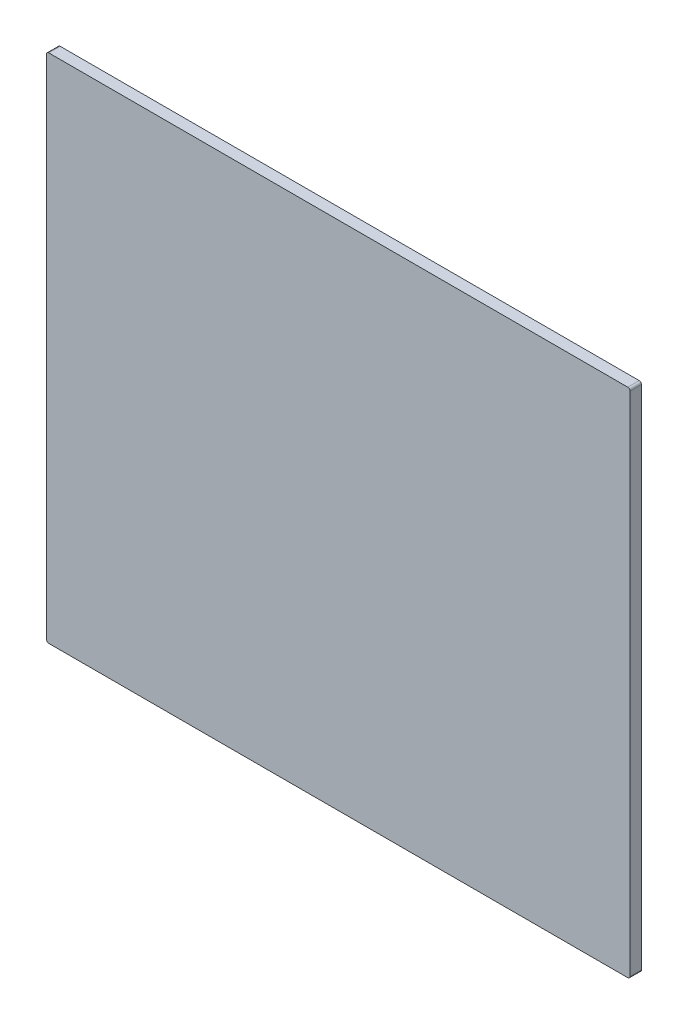
ISO-10303-21;
HEADER;
FILE_DESCRIPTION(('STEP AP214'),'2;1');
FILE_NAME('part.step','',(''),(''),'','','');
FILE_SCHEMA(('AUTOMOTIVE_DESIGN { 1 0 10303 214 1 1 1 1 }'));
ENDSEC;
DATA;
#1=APPLICATION_CONTEXT('core data for automotive mechanical design processes');
#2=APPLICATION_PROTOCOL_DEFINITION('international standard','automotive_design',2000,#1);
#3=PRODUCT_CONTEXT('',#1,'mechanical');
#4=PRODUCT('Part','Part','',(#3));
#5=PRODUCT_RELATED_PRODUCT_CATEGORY('part','',(#4));
#6=PRODUCT_DEFINITION_FORMATION('','',#4);
#7=PRODUCT_DEFINITION_CONTEXT('part definition',#1,'design');
#8=PRODUCT_DEFINITION('design','',#6,#7);
#9=PRODUCT_DEFINITION_SHAPE('','',#8);
#10=(LENGTH_UNIT() NAMED_UNIT(*) SI_UNIT(.MILLI.,.METRE.));
#11=(NAMED_UNIT(*) PLANE_ANGLE_UNIT() SI_UNIT($,.RADIAN.));
#12=(NAMED_UNIT(*) SI_UNIT($,.STERADIAN.) SOLID_ANGLE_UNIT());
#13=UNCERTAINTY_MEASURE_WITH_UNIT(LENGTH_MEASURE(1.E-05),#10,'distance_accuracy_value','');
#14=(GEOMETRIC_REPRESENTATION_CONTEXT(3) GLOBAL_UNCERTAINTY_ASSIGNED_CONTEXT((#13)) GLOBAL_UNIT_ASSIGNED_CONTEXT((#10,
#11,#12)) REPRESENTATION_CONTEXT('',''));
#15=CARTESIAN_POINT('',(0.,0.,0.));
#16=DIRECTION('',(0.,0.,1.));
#17=DIRECTION('',(1.,0.,0.));
#18=AXIS2_PLACEMENT_3D('',#15,#16,#17);
#19=CARTESIAN_POINT('',(-224.976704426795,260.726402714932,12.7));
#20=DIRECTION('',(0.,1.,0.));
#21=DIRECTION('',(0.,0.,1.));
#22=AXIS2_PLACEMENT_3D('',#19,#20,#21);
#23=PLANE('',#22);
#24=DIRECTION('',(1.,0.,0.));
#25=VECTOR('',#24,1.);
#26=CARTESIAN_POINT('',(-224.976704426795,260.726402714932,12.7));
#27=LINE('',#26,#25);
#28=CARTESIAN_POINT('',(-222.436704426795,260.726402714932,12.7));
#29=VERTEX_POINT('',#28);
#30=CARTESIAN_POINT('',(420.183295573205,260.726402714932,12.7));
#31=VERTEX_POINT('',#30);
#32=EDGE_CURVE('E146',#29,#31,#27,.T.);
#33=ORIENTED_EDGE('',*,*,#32,.T.);
#34=DIRECTION('',(0.,0.,-1.));
#35=VECTOR('',#34,1.);
#36=CARTESIAN_POINT('',(420.183295573205,260.726402714932,12.7));
#37=LINE('',#36,#35);
#38=CARTESIAN_POINT('',(420.183295573205,260.726402714932,0.));
#39=VERTEX_POINT('',#38);
#40=EDGE_CURVE('E11',#31,#39,#37,.T.);
#41=ORIENTED_EDGE('',*,*,#40,.T.);
#42=DIRECTION('',(1.,0.,0.));
#43=VECTOR('',#42,1.);
#44=CARTESIAN_POINT('',(-224.976704426795,260.726402714932,0.));
#45=LINE('',#44,#43);
#46=CARTESIAN_POINT('',(-222.436704426795,260.726402714932,0.));
#47=VERTEX_POINT('',#46);
#48=EDGE_CURVE('E148',#47,#39,#45,.T.);
#49=ORIENTED_EDGE('',*,*,#48,.F.);
#50=DIRECTION('',(0.,0.,-1.));
#51=VECTOR('',#50,1.);
#52=CARTESIAN_POINT('',(-222.436704426795,260.726402714932,12.7));
#53=LINE('',#52,#51);
#54=EDGE_CURVE('E54',#47,#29,#53,.F.);
#55=ORIENTED_EDGE('',*,*,#54,.T.);
#56=EDGE_LOOP('',(#33,#41,#49,#55));
#57=FACE_BOUND('',#56,.T.);
#58=ADVANCED_FACE('F45',(#57),#23,.T.);
#59=CARTESIAN_POINT('',(-224.976704426795,260.726402714932,12.7));
#60=DIRECTION('',(1.,0.,0.));
#61=DIRECTION('',(0.,0.,-1.));
#62=AXIS2_PLACEMENT_3D('',#59,#60,#61);
#63=PLANE('',#62);
#64=DIRECTION('',(0.,-1.,0.));
#65=VECTOR('',#64,1.);
#66=CARTESIAN_POINT('',(-224.976704426795,260.726402714932,0.));
#67=LINE('',#66,#65);
#68=CARTESIAN_POINT('',(-224.976704426795,258.186402714932,0.));
#69=VERTEX_POINT('',#68);
#70=CARTESIAN_POINT('',(-224.976704426795,-304.423597285068,0.));
#71=VERTEX_POINT('',#70);
#72=EDGE_CURVE('E141',#69,#71,#67,.T.);
#73=ORIENTED_EDGE('',*,*,#72,.T.);
#74=DIRECTION('',(0.,0.,-1.));
#75=VECTOR('',#74,1.);
#76=CARTESIAN_POINT('',(-224.976704426795,-304.423597285068,12.7));
#77=LINE('',#76,#75);
#78=CARTESIAN_POINT('',(-224.976704426795,-304.423597285068,12.7));
#79=VERTEX_POINT('',#78);
#80=EDGE_CURVE('E118',#71,#79,#77,.F.);
#81=ORIENTED_EDGE('',*,*,#80,.T.);
#82=DIRECTION('',(0.,-1.,0.));
#83=VECTOR('',#82,1.);
#84=CARTESIAN_POINT('',(-224.976704426795,260.726402714932,12.7));
#85=LINE('',#84,#83);
#86=CARTESIAN_POINT('',(-224.976704426795,258.186402714932,12.7));
#87=VERTEX_POINT('',#86);
#88=EDGE_CURVE('E153',#87,#79,#85,.T.);
#89=ORIENTED_EDGE('',*,*,#88,.F.);
#90=DIRECTION('',(0.,0.,-1.));
#91=VECTOR('',#90,1.);
#92=CARTESIAN_POINT('',(-224.976704426795,258.186402714932,0.));
#93=LINE('',#92,#91);
#94=EDGE_CURVE('E124',#87,#69,#93,.T.);
#95=ORIENTED_EDGE('',*,*,#94,.T.);
#96=EDGE_LOOP('',(#73,#81,#89,#95));
#97=FACE_BOUND('',#96,.T.);
#98=ADVANCED_FACE('F202',(#97),#63,.F.);
#99=CARTESIAN_POINT('',(-224.976704426795,-306.963597285068,12.7));
#100=DIRECTION('',(0.,1.,0.));
#101=DIRECTION('',(-1.,0.,0.));
#102=AXIS2_PLACEMENT_3D('',#99,#100,#101);
#103=PLANE('',#102);
#104=DIRECTION('',(1.,0.,0.));
#105=VECTOR('',#104,1.);
#106=CARTESIAN_POINT('',(-224.976704426795,-306.963597285068,12.7));
#107=LINE('',#106,#105);
#108=CARTESIAN_POINT('',(-222.436704426795,-306.963597285068,12.7));
#109=VERTEX_POINT('',#108);
#110=CARTESIAN_POINT('',(420.183295573205,-306.963597285068,12.7));
#111=VERTEX_POINT('',#110);
#112=EDGE_CURVE('E133',#109,#111,#107,.T.);
#113=ORIENTED_EDGE('',*,*,#112,.F.);
#114=DIRECTION('',(0.,0.,-1.));
#115=VECTOR('',#114,1.);
#116=CARTESIAN_POINT('',(-222.436704426795,-306.963597285068,12.7));
#117=LINE('',#116,#115);
#118=CARTESIAN_POINT('',(-222.436704426795,-306.963597285068,0.));
#119=VERTEX_POINT('',#118);
#120=EDGE_CURVE('E117',#109,#119,#117,.T.);
#121=ORIENTED_EDGE('',*,*,#120,.T.);
#122=DIRECTION('',(1.,0.,0.));
#123=VECTOR('',#122,1.);
#124=CARTESIAN_POINT('',(-224.976704426795,-306.963597285068,0.));
#125=LINE('',#124,#123);
#126=CARTESIAN_POINT('',(420.183295573205,-306.963597285068,0.));
#127=VERTEX_POINT('',#126);
#128=EDGE_CURVE('E131',#119,#127,#125,.T.);
#129=ORIENTED_EDGE('',*,*,#128,.T.);
#130=DIRECTION('',(0.,0.,-1.));
#131=VECTOR('',#130,1.);
#132=CARTESIAN_POINT('',(420.183295573205,-306.963597285068,12.7));
#133=LINE('',#132,#131);
#134=EDGE_CURVE('E136',#127,#111,#133,.F.);
#135=ORIENTED_EDGE('',*,*,#134,.T.);
#136=EDGE_LOOP('',(#113,#121,#129,#135));
#137=FACE_BOUND('',#136,.T.);
#138=ADVANCED_FACE('F130',(#137),#103,.F.);
#139=CARTESIAN_POINT('',(422.723295573205,260.726402714932,12.7));
#140=DIRECTION('',(1.,0.,0.));
#141=DIRECTION('',(0.,1.,0.));
#142=AXIS2_PLACEMENT_3D('',#139,#140,#141);
#143=PLANE('',#142);
#144=DIRECTION('',(0.,-1.,0.));
#145=VECTOR('',#144,1.);
#146=CARTESIAN_POINT('',(422.723295573205,260.726402714932,12.7));
#147=LINE('',#146,#145);
#148=CARTESIAN_POINT('',(422.723295573205,258.186402714932,12.7));
#149=VERTEX_POINT('',#148);
#150=CARTESIAN_POINT('',(422.723295573205,-304.423597285068,12.7));
#151=VERTEX_POINT('',#150);
#152=EDGE_CURVE('E198',#149,#151,#147,.T.);
#153=ORIENTED_EDGE('',*,*,#152,.T.);
#154=DIRECTION('',(0.,0.,-1.));
#155=VECTOR('',#154,1.);
#156=CARTESIAN_POINT('',(422.723295573205,-304.423597285068,0.));
#157=LINE('',#156,#155);
#158=CARTESIAN_POINT('',(422.723295573205,-304.423597285068,0.));
#159=VERTEX_POINT('',#158);
#160=EDGE_CURVE('E180',#151,#159,#157,.T.);
#161=ORIENTED_EDGE('',*,*,#160,.T.);
#162=DIRECTION('',(0.,-1.,0.));
#163=VECTOR('',#162,1.);
#164=CARTESIAN_POINT('',(422.723295573205,260.726402714932,0.));
#165=LINE('',#164,#163);
#166=CARTESIAN_POINT('',(422.723295573205,258.186402714932,0.));
#167=VERTEX_POINT('',#166);
#168=EDGE_CURVE('E142',#167,#159,#165,.T.);
#169=ORIENTED_EDGE('',*,*,#168,.F.);
#170=DIRECTION('',(0.,0.,-1.));
#171=VECTOR('',#170,1.);
#172=CARTESIAN_POINT('',(422.723295573205,258.186402714932,12.7));
#173=LINE('',#172,#171);
#174=EDGE_CURVE('E68',#167,#149,#173,.F.);
#175=ORIENTED_EDGE('',*,*,#174,.T.);
#176=EDGE_LOOP('',(#153,#161,#169,#175));
#177=FACE_BOUND('',#176,.T.);
#178=ADVANCED_FACE('F211',(#177),#143,.T.);
#179=CARTESIAN_POINT('',(0.,0.,12.7));
#180=DIRECTION('',(0.,0.,-1.));
#181=DIRECTION('',(-1.,0.,0.));
#182=AXIS2_PLACEMENT_3D('',#179,#180,#181);
#183=PLANE('',#182);
#184=ORIENTED_EDGE('',*,*,#88,.T.);
#185=CARTESIAN_POINT('',(-222.436704426795,-304.423597285068,12.7));
#186=DIRECTION('',(0.,0.,-1.));
#187=DIRECTION('',(-1.,0.,0.));
#188=AXIS2_PLACEMENT_3D('',#185,#186,#187);
#189=CIRCLE('',#188,2.54);
#190=EDGE_CURVE('E175',#79,#109,#189,.F.);
#191=ORIENTED_EDGE('',*,*,#190,.T.);
#192=ORIENTED_EDGE('',*,*,#112,.T.);
#193=CARTESIAN_POINT('',(420.183295573205,-304.423597285068,12.7));
#194=DIRECTION('',(0.,0.,-1.));
#195=DIRECTION('',(-1.,0.,0.));
#196=AXIS2_PLACEMENT_3D('',#193,#194,#195);
#197=CIRCLE('',#196,2.54);
#198=EDGE_CURVE('E61',#111,#151,#197,.F.);
#199=ORIENTED_EDGE('',*,*,#198,.T.);
#200=ORIENTED_EDGE('',*,*,#152,.F.);
#201=CARTESIAN_POINT('',(420.183295573205,258.186402714932,12.7));
#202=DIRECTION('',(0.,0.,-1.));
#203=DIRECTION('',(-1.,0.,0.));
#204=AXIS2_PLACEMENT_3D('',#201,#202,#203);
#205=CIRCLE('',#204,2.54);
#206=EDGE_CURVE('E170',#149,#31,#205,.F.);
#207=ORIENTED_EDGE('',*,*,#206,.T.);
#208=ORIENTED_EDGE('',*,*,#32,.F.);
#209=CARTESIAN_POINT('',(-222.436704426795,258.186402714932,12.7));
#210=DIRECTION('',(0.,0.,-1.));
#211=DIRECTION('',(-1.,0.,0.));
#212=AXIS2_PLACEMENT_3D('',#209,#210,#211);
#213=CIRCLE('',#212,2.54);
#214=EDGE_CURVE('E167',#29,#87,#213,.F.);
#215=ORIENTED_EDGE('',*,*,#214,.T.);
#216=EDGE_LOOP('',(#184,#191,#192,#199,#200,#207,#208,#215));
#217=FACE_BOUND('',#216,.T.);
#218=ADVANCED_FACE('F194',(#217),#183,.F.);
#219=CARTESIAN_POINT('',(0.,0.,0.));
#220=DIRECTION('',(0.,0.,-1.));
#221=DIRECTION('',(-1.,0.,0.));
#222=AXIS2_PLACEMENT_3D('',#219,#220,#221);
#223=PLANE('',#222);
#224=ORIENTED_EDGE('',*,*,#128,.F.);
#225=CARTESIAN_POINT('',(-222.436704426795,-304.423597285068,0.));
#226=DIRECTION('',(0.,0.,-1.));
#227=DIRECTION('',(-1.,0.,0.));
#228=AXIS2_PLACEMENT_3D('',#225,#226,#227);
#229=CIRCLE('',#228,2.54);
#230=EDGE_CURVE('E113',#119,#71,#229,.T.);
#231=ORIENTED_EDGE('',*,*,#230,.T.);
#232=ORIENTED_EDGE('',*,*,#72,.F.);
#233=CARTESIAN_POINT('',(-222.436704426795,258.186402714932,0.));
#234=DIRECTION('',(0.,0.,-1.));
#235=DIRECTION('',(-1.,0.,0.));
#236=AXIS2_PLACEMENT_3D('',#233,#234,#235);
#237=CIRCLE('',#236,2.54);
#238=EDGE_CURVE('E135',#69,#47,#237,.T.);
#239=ORIENTED_EDGE('',*,*,#238,.T.);
#240=ORIENTED_EDGE('',*,*,#48,.T.);
#241=CARTESIAN_POINT('',(420.183295573205,258.186402714932,0.));
#242=DIRECTION('',(0.,0.,-1.));
#243=DIRECTION('',(-1.,0.,0.));
#244=AXIS2_PLACEMENT_3D('',#241,#242,#243);
#245=CIRCLE('',#244,2.54);
#246=EDGE_CURVE('E157',#39,#167,#245,.T.);
#247=ORIENTED_EDGE('',*,*,#246,.T.);
#248=ORIENTED_EDGE('',*,*,#168,.T.);
#249=CARTESIAN_POINT('',(420.183295573205,-304.423597285068,0.));
#250=DIRECTION('',(0.,0.,-1.));
#251=DIRECTION('',(-1.,0.,0.));
#252=AXIS2_PLACEMENT_3D('',#249,#250,#251);
#253=CIRCLE('',#252,2.54);
#254=EDGE_CURVE('E125',#159,#127,#253,.T.);
#255=ORIENTED_EDGE('',*,*,#254,.T.);
#256=EDGE_LOOP('',(#224,#231,#232,#239,#240,#247,#248,#255));
#257=FACE_BOUND('',#256,.T.);
#258=ADVANCED_FACE('F138',(#257),#223,.T.);
#259=CARTESIAN_POINT('',(-222.436704426795,-304.423597285068,12.7));
#260=DIRECTION('',(0.,0.,-1.));
#261=DIRECTION('',(-1.,0.,0.));
#262=AXIS2_PLACEMENT_3D('',#259,#260,#261);
#263=CYLINDRICAL_SURFACE('',#262,2.54);
#264=ORIENTED_EDGE('',*,*,#190,.F.);
#265=ORIENTED_EDGE('',*,*,#80,.F.);
#266=ORIENTED_EDGE('',*,*,#230,.F.);
#267=ORIENTED_EDGE('',*,*,#120,.F.);
#268=EDGE_LOOP('',(#264,#265,#266,#267));
#269=FACE_BOUND('',#268,.T.);
#270=ADVANCED_FACE('F116',(#269),#263,.T.);
#271=CARTESIAN_POINT('',(420.183295573205,-304.423597285068,12.7));
#272=DIRECTION('',(0.,0.,1.));
#273=DIRECTION('',(1.,0.,0.));
#274=AXIS2_PLACEMENT_3D('',#271,#272,#273);
#275=CYLINDRICAL_SURFACE('',#274,2.54);
#276=ORIENTED_EDGE('',*,*,#198,.F.);
#277=ORIENTED_EDGE('',*,*,#134,.F.);
#278=ORIENTED_EDGE('',*,*,#254,.F.);
#279=ORIENTED_EDGE('',*,*,#160,.F.);
#280=EDGE_LOOP('',(#276,#277,#278,#279));
#281=FACE_BOUND('',#280,.T.);
#282=ADVANCED_FACE('F213',(#281),#275,.T.);
#283=CARTESIAN_POINT('',(420.183295573205,258.186402714932,12.7));
#284=DIRECTION('',(0.,0.,-1.));
#285=DIRECTION('',(-1.,0.,0.));
#286=AXIS2_PLACEMENT_3D('',#283,#284,#285);
#287=CYLINDRICAL_SURFACE('',#286,2.54);
#288=ORIENTED_EDGE('',*,*,#206,.F.);
#289=ORIENTED_EDGE('',*,*,#174,.F.);
#290=ORIENTED_EDGE('',*,*,#246,.F.);
#291=ORIENTED_EDGE('',*,*,#40,.F.);
#292=EDGE_LOOP('',(#288,#289,#290,#291));
#293=FACE_BOUND('',#292,.T.);
#294=ADVANCED_FACE('F215',(#293),#287,.T.);
#295=CARTESIAN_POINT('',(-222.436704426795,258.186402714932,12.7));
#296=DIRECTION('',(0.,0.,1.));
#297=DIRECTION('',(1.,0.,0.));
#298=AXIS2_PLACEMENT_3D('',#295,#296,#297);
#299=CYLINDRICAL_SURFACE('',#298,2.54);
#300=ORIENTED_EDGE('',*,*,#214,.F.);
#301=ORIENTED_EDGE('',*,*,#54,.F.);
#302=ORIENTED_EDGE('',*,*,#238,.F.);
#303=ORIENTED_EDGE('',*,*,#94,.F.);
#304=EDGE_LOOP('',(#300,#301,#302,#303));
#305=FACE_BOUND('',#304,.T.);
#306=ADVANCED_FACE('F47',(#305),#299,.T.);
#307=CLOSED_SHELL('',(#58,#98,#138,#178,#218,#258,#270,#282,#294,#306));
#308=MANIFOLD_SOLID_BREP('B2',#307);
#309=ADVANCED_BREP_SHAPE_REPRESENTATION('',(#18,#308),#14);
#310=SHAPE_DEFINITION_REPRESENTATION(#9,#309);
ENDSEC;
END-ISO-10303-21;
